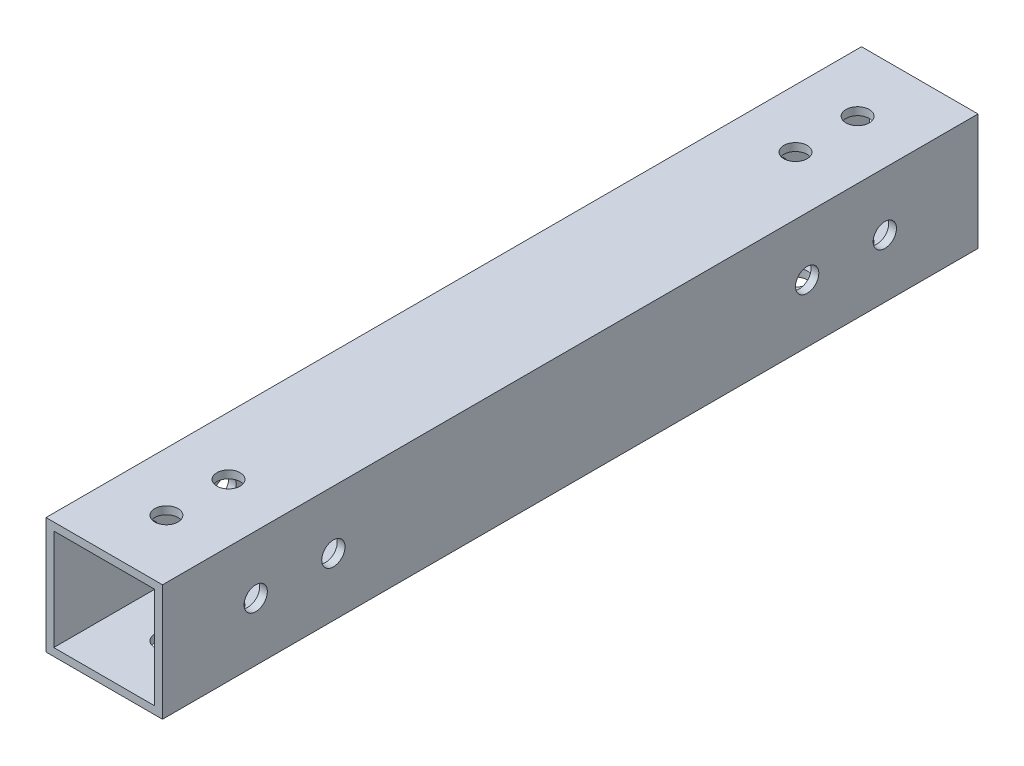
ISO-10303-21;
HEADER;
FILE_DESCRIPTION(('STEP AP214'),'2;1');
FILE_NAME('part.step','',(''),(''),'','','');
FILE_SCHEMA(('AUTOMOTIVE_DESIGN { 1 0 10303 214 1 1 1 1 }'));
ENDSEC;
DATA;
#1=APPLICATION_CONTEXT('core data for automotive mechanical design processes');
#2=APPLICATION_PROTOCOL_DEFINITION('international standard','automotive_design',2000,#1);
#3=PRODUCT_CONTEXT('',#1,'mechanical');
#4=PRODUCT('Part','Part','',(#3));
#5=PRODUCT_RELATED_PRODUCT_CATEGORY('part','',(#4));
#6=PRODUCT_DEFINITION_FORMATION('','',#4);
#7=PRODUCT_DEFINITION_CONTEXT('part definition',#1,'design');
#8=PRODUCT_DEFINITION('design','',#6,#7);
#9=PRODUCT_DEFINITION_SHAPE('','',#8);
#10=(LENGTH_UNIT() NAMED_UNIT(*) SI_UNIT(.MILLI.,.METRE.));
#11=(NAMED_UNIT(*) PLANE_ANGLE_UNIT() SI_UNIT($,.RADIAN.));
#12=(NAMED_UNIT(*) SI_UNIT($,.STERADIAN.) SOLID_ANGLE_UNIT());
#13=UNCERTAINTY_MEASURE_WITH_UNIT(LENGTH_MEASURE(1.E-05),#10,'distance_accuracy_value','');
#14=(GEOMETRIC_REPRESENTATION_CONTEXT(3) GLOBAL_UNCERTAINTY_ASSIGNED_CONTEXT((#13)) GLOBAL_UNIT_ASSIGNED_CONTEXT((#10,
#11,#12)) REPRESENTATION_CONTEXT('',''));
#15=CARTESIAN_POINT('',(0.,0.,0.));
#16=DIRECTION('',(0.,0.,1.));
#17=DIRECTION('',(1.,0.,0.));
#18=AXIS2_PLACEMENT_3D('',#15,#16,#17);
#19=CARTESIAN_POINT('',(0.,0.,105.));
#20=DIRECTION('',(0.,0.,-1.));
#21=DIRECTION('',(-1.,0.,0.));
#22=AXIS2_PLACEMENT_3D('',#19,#20,#21);
#23=PLANE('',#22);
#24=DIRECTION('',(0.,1.,0.));
#25=VECTOR('',#24,1.);
#26=CARTESIAN_POINT('',(7.5,-7.5,105.));
#27=LINE('',#26,#25);
#28=CARTESIAN_POINT('',(7.5,-7.5,105.));
#29=VERTEX_POINT('',#28);
#30=CARTESIAN_POINT('',(7.5,7.5,105.));
#31=VERTEX_POINT('',#30);
#32=EDGE_CURVE('E139',#29,#31,#27,.T.);
#33=ORIENTED_EDGE('',*,*,#32,.T.);
#34=DIRECTION('',(-1.,0.,0.));
#35=VECTOR('',#34,1.);
#36=CARTESIAN_POINT('',(-7.5,7.5,105.));
#37=LINE('',#36,#35);
#38=CARTESIAN_POINT('',(-7.5,7.5,105.));
#39=VERTEX_POINT('',#38);
#40=EDGE_CURVE('E142',#31,#39,#37,.T.);
#41=ORIENTED_EDGE('',*,*,#40,.T.);
#42=DIRECTION('',(0.,-1.,0.));
#43=VECTOR('',#42,1.);
#44=CARTESIAN_POINT('',(-7.5,-7.5,105.));
#45=LINE('',#44,#43);
#46=CARTESIAN_POINT('',(-7.5,-7.5,105.));
#47=VERTEX_POINT('',#46);
#48=EDGE_CURVE('E145',#39,#47,#45,.T.);
#49=ORIENTED_EDGE('',*,*,#48,.T.);
#50=DIRECTION('',(1.,0.,0.));
#51=VECTOR('',#50,1.);
#52=CARTESIAN_POINT('',(-7.5,-7.5,105.));
#53=LINE('',#52,#51);
#54=EDGE_CURVE('E147',#47,#29,#53,.T.);
#55=ORIENTED_EDGE('',*,*,#54,.T.);
#56=EDGE_LOOP('',(#33,#41,#49,#55));
#57=FACE_BOUND('',#56,.T.);
#58=DIRECTION('',(0.,1.,0.));
#59=VECTOR('',#58,1.);
#60=CARTESIAN_POINT('',(6.5,-6.5,105.));
#61=LINE('',#60,#59);
#62=CARTESIAN_POINT('',(6.5,-6.5,105.));
#63=VERTEX_POINT('',#62);
#64=CARTESIAN_POINT('',(6.5,6.5,105.));
#65=VERTEX_POINT('',#64);
#66=EDGE_CURVE('E101',#63,#65,#61,.T.);
#67=ORIENTED_EDGE('',*,*,#66,.F.);
#68=DIRECTION('',(1.,0.,0.));
#69=VECTOR('',#68,1.);
#70=CARTESIAN_POINT('',(-6.5,-6.5,105.));
#71=LINE('',#70,#69);
#72=CARTESIAN_POINT('',(-6.5,-6.5,105.));
#73=VERTEX_POINT('',#72);
#74=EDGE_CURVE('E123',#73,#63,#71,.T.);
#75=ORIENTED_EDGE('',*,*,#74,.F.);
#76=DIRECTION('',(0.,-1.,0.));
#77=VECTOR('',#76,1.);
#78=CARTESIAN_POINT('',(-6.5,-6.5,105.));
#79=LINE('',#78,#77);
#80=CARTESIAN_POINT('',(-6.5,6.5,105.));
#81=VERTEX_POINT('',#80);
#82=EDGE_CURVE('E121',#81,#73,#79,.T.);
#83=ORIENTED_EDGE('',*,*,#82,.F.);
#84=DIRECTION('',(-1.,0.,0.));
#85=VECTOR('',#84,1.);
#86=CARTESIAN_POINT('',(-6.5,6.5,105.));
#87=LINE('',#86,#85);
#88=EDGE_CURVE('E109',#65,#81,#87,.T.);
#89=ORIENTED_EDGE('',*,*,#88,.F.);
#90=EDGE_LOOP('',(#67,#75,#83,#89));
#91=FACE_BOUND('',#90,.T.);
#92=ADVANCED_FACE('F34',(#57,#91),#23,.F.);
#93=CARTESIAN_POINT('',(0.,0.,0.));
#94=DIRECTION('',(0.,0.,-1.));
#95=DIRECTION('',(-1.,0.,0.));
#96=AXIS2_PLACEMENT_3D('',#93,#94,#95);
#97=PLANE('',#96);
#98=DIRECTION('',(0.,1.,0.));
#99=VECTOR('',#98,1.);
#100=CARTESIAN_POINT('',(7.5,-7.5,0.));
#101=LINE('',#100,#99);
#102=CARTESIAN_POINT('',(7.5,-7.5,0.));
#103=VERTEX_POINT('',#102);
#104=CARTESIAN_POINT('',(7.5,7.5,0.));
#105=VERTEX_POINT('',#104);
#106=EDGE_CURVE('E117',#103,#105,#101,.T.);
#107=ORIENTED_EDGE('',*,*,#106,.F.);
#108=DIRECTION('',(1.,0.,0.));
#109=VECTOR('',#108,1.);
#110=CARTESIAN_POINT('',(-7.5,-7.5,0.));
#111=LINE('',#110,#109);
#112=CARTESIAN_POINT('',(-7.5,-7.5,0.));
#113=VERTEX_POINT('',#112);
#114=EDGE_CURVE('E143',#113,#103,#111,.T.);
#115=ORIENTED_EDGE('',*,*,#114,.F.);
#116=DIRECTION('',(0.,-1.,0.));
#117=VECTOR('',#116,1.);
#118=CARTESIAN_POINT('',(-7.5,-7.5,0.));
#119=LINE('',#118,#117);
#120=CARTESIAN_POINT('',(-7.5,7.5,0.));
#121=VERTEX_POINT('',#120);
#122=EDGE_CURVE('E154',#121,#113,#119,.T.);
#123=ORIENTED_EDGE('',*,*,#122,.F.);
#124=DIRECTION('',(-1.,0.,0.));
#125=VECTOR('',#124,1.);
#126=CARTESIAN_POINT('',(-7.5,7.5,0.));
#127=LINE('',#126,#125);
#128=EDGE_CURVE('E152',#105,#121,#127,.T.);
#129=ORIENTED_EDGE('',*,*,#128,.F.);
#130=EDGE_LOOP('',(#107,#115,#123,#129));
#131=FACE_BOUND('',#130,.T.);
#132=DIRECTION('',(1.,0.,0.));
#133=VECTOR('',#132,1.);
#134=CARTESIAN_POINT('',(-6.5,-6.5,0.));
#135=LINE('',#134,#133);
#136=CARTESIAN_POINT('',(-6.5,-6.5,0.));
#137=VERTEX_POINT('',#136);
#138=CARTESIAN_POINT('',(6.5,-6.5,0.));
#139=VERTEX_POINT('',#138);
#140=EDGE_CURVE('E110',#137,#139,#135,.T.);
#141=ORIENTED_EDGE('',*,*,#140,.T.);
#142=DIRECTION('',(0.,1.,0.));
#143=VECTOR('',#142,1.);
#144=CARTESIAN_POINT('',(6.5,-6.5,0.));
#145=LINE('',#144,#143);
#146=CARTESIAN_POINT('',(6.5,6.5,0.));
#147=VERTEX_POINT('',#146);
#148=EDGE_CURVE('E59',#139,#147,#145,.T.);
#149=ORIENTED_EDGE('',*,*,#148,.T.);
#150=DIRECTION('',(-1.,0.,0.));
#151=VECTOR('',#150,1.);
#152=CARTESIAN_POINT('',(-6.5,6.5,0.));
#153=LINE('',#152,#151);
#154=CARTESIAN_POINT('',(-6.5,6.5,0.));
#155=VERTEX_POINT('',#154);
#156=EDGE_CURVE('E116',#147,#155,#153,.T.);
#157=ORIENTED_EDGE('',*,*,#156,.T.);
#158=DIRECTION('',(0.,-1.,0.));
#159=VECTOR('',#158,1.);
#160=CARTESIAN_POINT('',(-6.5,-6.5,0.));
#161=LINE('',#160,#159);
#162=EDGE_CURVE('E131',#155,#137,#161,.T.);
#163=ORIENTED_EDGE('',*,*,#162,.T.);
#164=EDGE_LOOP('',(#141,#149,#157,#163));
#165=FACE_BOUND('',#164,.T.);
#166=ADVANCED_FACE('F265',(#131,#165),#97,.T.);
#167=CARTESIAN_POINT('',(7.5,-7.5,105.));
#168=DIRECTION('',(-1.,0.,0.));
#169=DIRECTION('',(0.,0.,1.));
#170=AXIS2_PLACEMENT_3D('',#167,#168,#169);
#171=PLANE('',#170);
#172=CARTESIAN_POINT('',(7.5,0.,83.));
#173=DIRECTION('',(-1.,0.,0.));
#174=DIRECTION('',(0.,0.,1.));
#175=AXIS2_PLACEMENT_3D('',#172,#173,#174);
#176=CIRCLE('',#175,1.5);
#177=CARTESIAN_POINT('',(7.5,0.,84.5));
#178=VERTEX_POINT('',#177);
#179=EDGE_CURVE('E189',#178,#178,#176,.T.);
#180=ORIENTED_EDGE('',*,*,#179,.T.);
#181=EDGE_LOOP('',(#180));
#182=FACE_BOUND('',#181,.T.);
#183=CARTESIAN_POINT('',(7.5,0.,12.));
#184=DIRECTION('',(-1.,0.,0.));
#185=DIRECTION('',(0.,0.,1.));
#186=AXIS2_PLACEMENT_3D('',#183,#184,#185);
#187=CIRCLE('',#186,1.5);
#188=CARTESIAN_POINT('',(7.5,0.,13.5));
#189=VERTEX_POINT('',#188);
#190=EDGE_CURVE('E373',#189,#189,#187,.T.);
#191=ORIENTED_EDGE('',*,*,#190,.T.);
#192=EDGE_LOOP('',(#191));
#193=FACE_BOUND('',#192,.T.);
#194=CARTESIAN_POINT('',(7.5,0.,22.));
#195=DIRECTION('',(-1.,0.,0.));
#196=DIRECTION('',(0.,0.,1.));
#197=AXIS2_PLACEMENT_3D('',#194,#195,#196);
#198=CIRCLE('',#197,1.5);
#199=CARTESIAN_POINT('',(7.5,0.,23.5));
#200=VERTEX_POINT('',#199);
#201=EDGE_CURVE('E380',#200,#200,#198,.T.);
#202=ORIENTED_EDGE('',*,*,#201,.T.);
#203=EDGE_LOOP('',(#202));
#204=FACE_BOUND('',#203,.T.);
#205=CARTESIAN_POINT('',(7.5,0.,93.));
#206=DIRECTION('',(-1.,0.,0.));
#207=DIRECTION('',(0.,0.,1.));
#208=AXIS2_PLACEMENT_3D('',#205,#206,#207);
#209=CIRCLE('',#208,1.5);
#210=CARTESIAN_POINT('',(7.5,0.,94.5));
#211=VERTEX_POINT('',#210);
#212=EDGE_CURVE('E185',#211,#211,#209,.T.);
#213=ORIENTED_EDGE('',*,*,#212,.T.);
#214=EDGE_LOOP('',(#213));
#215=FACE_BOUND('',#214,.T.);
#216=ORIENTED_EDGE('',*,*,#106,.T.);
#217=DIRECTION('',(0.,0.,-1.));
#218=VECTOR('',#217,1.);
#219=CARTESIAN_POINT('',(7.5,7.5,105.));
#220=LINE('',#219,#218);
#221=EDGE_CURVE('E11',#31,#105,#220,.T.);
#222=ORIENTED_EDGE('',*,*,#221,.F.);
#223=ORIENTED_EDGE('',*,*,#32,.F.);
#224=DIRECTION('',(0.,0.,-1.));
#225=VECTOR('',#224,1.);
#226=CARTESIAN_POINT('',(7.5,-7.5,105.));
#227=LINE('',#226,#225);
#228=EDGE_CURVE('E149',#29,#103,#227,.T.);
#229=ORIENTED_EDGE('',*,*,#228,.T.);
#230=EDGE_LOOP('',(#216,#222,#223,#229));
#231=FACE_BOUND('',#230,.T.);
#232=ADVANCED_FACE('F36',(#182,#193,#204,#215,#231),#171,.F.);
#233=CARTESIAN_POINT('',(-7.5,7.5,105.));
#234=DIRECTION('',(0.,-1.,0.));
#235=DIRECTION('',(0.,0.,-1.));
#236=AXIS2_PLACEMENT_3D('',#233,#234,#235);
#237=PLANE('',#236);
#238=CARTESIAN_POINT('',(0.,7.5,89.));
#239=DIRECTION('',(0.,1.,0.));
#240=DIRECTION('',(0.,0.,1.));
#241=AXIS2_PLACEMENT_3D('',#238,#239,#240);
#242=CIRCLE('',#241,1.5);
#243=CARTESIAN_POINT('',(0.,7.5,90.5));
#244=VERTEX_POINT('',#243);
#245=EDGE_CURVE('E218',#244,#244,#242,.T.);
#246=ORIENTED_EDGE('',*,*,#245,.F.);
#247=EDGE_LOOP('',(#246));
#248=FACE_BOUND('',#247,.T.);
#249=CARTESIAN_POINT('',(0.,7.5,8.));
#250=DIRECTION('',(0.,1.,0.));
#251=DIRECTION('',(0.,0.,1.));
#252=AXIS2_PLACEMENT_3D('',#249,#250,#251);
#253=CIRCLE('',#252,1.5);
#254=CARTESIAN_POINT('',(0.,7.5,9.5));
#255=VERTEX_POINT('',#254);
#256=EDGE_CURVE('E224',#255,#255,#253,.T.);
#257=ORIENTED_EDGE('',*,*,#256,.F.);
#258=EDGE_LOOP('',(#257));
#259=FACE_BOUND('',#258,.T.);
#260=CARTESIAN_POINT('',(0.,7.5,16.));
#261=DIRECTION('',(0.,1.,0.));
#262=DIRECTION('',(0.,0.,1.));
#263=AXIS2_PLACEMENT_3D('',#260,#261,#262);
#264=CIRCLE('',#263,1.5);
#265=CARTESIAN_POINT('',(0.,7.5,17.5));
#266=VERTEX_POINT('',#265);
#267=EDGE_CURVE('E215',#266,#266,#264,.T.);
#268=ORIENTED_EDGE('',*,*,#267,.F.);
#269=EDGE_LOOP('',(#268));
#270=FACE_BOUND('',#269,.T.);
#271=CARTESIAN_POINT('',(0.,7.5,97.));
#272=DIRECTION('',(0.,1.,0.));
#273=DIRECTION('',(0.,0.,1.));
#274=AXIS2_PLACEMENT_3D('',#271,#272,#273);
#275=CIRCLE('',#274,1.5);
#276=CARTESIAN_POINT('',(0.,7.5,98.5));
#277=VERTEX_POINT('',#276);
#278=EDGE_CURVE('E238',#277,#277,#275,.T.);
#279=ORIENTED_EDGE('',*,*,#278,.F.);
#280=EDGE_LOOP('',(#279));
#281=FACE_BOUND('',#280,.T.);
#282=ORIENTED_EDGE('',*,*,#128,.T.);
#283=DIRECTION('',(0.,0.,-1.));
#284=VECTOR('',#283,1.);
#285=CARTESIAN_POINT('',(-7.5,7.5,105.));
#286=LINE('',#285,#284);
#287=EDGE_CURVE('E43',#39,#121,#286,.T.);
#288=ORIENTED_EDGE('',*,*,#287,.F.);
#289=ORIENTED_EDGE('',*,*,#40,.F.);
#290=ORIENTED_EDGE('',*,*,#221,.T.);
#291=EDGE_LOOP('',(#282,#288,#289,#290));
#292=FACE_BOUND('',#291,.T.);
#293=ADVANCED_FACE('F279',(#248,#259,#270,#281,#292),#237,.F.);
#294=CARTESIAN_POINT('',(-7.5,-7.5,105.));
#295=DIRECTION('',(1.,0.,0.));
#296=DIRECTION('',(0.,0.,-1.));
#297=AXIS2_PLACEMENT_3D('',#294,#295,#296);
#298=PLANE('',#297);
#299=CARTESIAN_POINT('',(-7.5,0.,83.));
#300=DIRECTION('',(-1.,0.,0.));
#301=DIRECTION('',(0.,0.,1.));
#302=AXIS2_PLACEMENT_3D('',#299,#300,#301);
#303=CIRCLE('',#302,1.5);
#304=CARTESIAN_POINT('',(-7.5,0.,84.5));
#305=VERTEX_POINT('',#304);
#306=EDGE_CURVE('E370',#305,#305,#303,.T.);
#307=ORIENTED_EDGE('',*,*,#306,.F.);
#308=EDGE_LOOP('',(#307));
#309=FACE_BOUND('',#308,.T.);
#310=CARTESIAN_POINT('',(-7.5,0.,12.));
#311=DIRECTION('',(-1.,0.,0.));
#312=DIRECTION('',(0.,0.,1.));
#313=AXIS2_PLACEMENT_3D('',#310,#311,#312);
#314=CIRCLE('',#313,1.5);
#315=CARTESIAN_POINT('',(-7.5,0.,13.5));
#316=VERTEX_POINT('',#315);
#317=EDGE_CURVE('E378',#316,#316,#314,.T.);
#318=ORIENTED_EDGE('',*,*,#317,.F.);
#319=EDGE_LOOP('',(#318));
#320=FACE_BOUND('',#319,.T.);
#321=CARTESIAN_POINT('',(-7.5,0.,22.));
#322=DIRECTION('',(-1.,0.,0.));
#323=DIRECTION('',(0.,0.,1.));
#324=AXIS2_PLACEMENT_3D('',#321,#322,#323);
#325=CIRCLE('',#324,1.5);
#326=CARTESIAN_POINT('',(-7.5,0.,23.5));
#327=VERTEX_POINT('',#326);
#328=EDGE_CURVE('E202',#327,#327,#325,.T.);
#329=ORIENTED_EDGE('',*,*,#328,.F.);
#330=EDGE_LOOP('',(#329));
#331=FACE_BOUND('',#330,.T.);
#332=CARTESIAN_POINT('',(-7.5,0.,93.));
#333=DIRECTION('',(-1.,0.,0.));
#334=DIRECTION('',(0.,0.,1.));
#335=AXIS2_PLACEMENT_3D('',#332,#333,#334);
#336=CIRCLE('',#335,1.5);
#337=CARTESIAN_POINT('',(-7.5,0.,94.5));
#338=VERTEX_POINT('',#337);
#339=EDGE_CURVE('E208',#338,#338,#336,.T.);
#340=ORIENTED_EDGE('',*,*,#339,.F.);
#341=EDGE_LOOP('',(#340));
#342=FACE_BOUND('',#341,.T.);
#343=ORIENTED_EDGE('',*,*,#122,.T.);
#344=DIRECTION('',(0.,0.,-1.));
#345=VECTOR('',#344,1.);
#346=CARTESIAN_POINT('',(-7.5,-7.5,105.));
#347=LINE('',#346,#345);
#348=EDGE_CURVE('E159',#47,#113,#347,.T.);
#349=ORIENTED_EDGE('',*,*,#348,.F.);
#350=ORIENTED_EDGE('',*,*,#48,.F.);
#351=ORIENTED_EDGE('',*,*,#287,.T.);
#352=EDGE_LOOP('',(#343,#349,#350,#351));
#353=FACE_BOUND('',#352,.T.);
#354=ADVANCED_FACE('F276',(#309,#320,#331,#342,#353),#298,.F.);
#355=CARTESIAN_POINT('',(-7.5,-7.5,105.));
#356=DIRECTION('',(0.,1.,0.));
#357=DIRECTION('',(0.,0.,1.));
#358=AXIS2_PLACEMENT_3D('',#355,#356,#357);
#359=PLANE('',#358);
#360=CARTESIAN_POINT('',(0.,-7.5,89.));
#361=DIRECTION('',(0.,1.,0.));
#362=DIRECTION('',(0.,0.,1.));
#363=AXIS2_PLACEMENT_3D('',#360,#361,#362);
#364=CIRCLE('',#363,1.5);
#365=CARTESIAN_POINT('',(0.,-7.5,90.5));
#366=VERTEX_POINT('',#365);
#367=EDGE_CURVE('E172',#366,#366,#364,.T.);
#368=ORIENTED_EDGE('',*,*,#367,.T.);
#369=EDGE_LOOP('',(#368));
#370=FACE_BOUND('',#369,.T.);
#371=CARTESIAN_POINT('',(0.,-7.5,8.));
#372=DIRECTION('',(0.,1.,0.));
#373=DIRECTION('',(0.,0.,1.));
#374=AXIS2_PLACEMENT_3D('',#371,#372,#373);
#375=CIRCLE('',#374,1.5);
#376=CARTESIAN_POINT('',(0.,-7.5,9.5));
#377=VERTEX_POINT('',#376);
#378=EDGE_CURVE('E221',#377,#377,#375,.T.);
#379=ORIENTED_EDGE('',*,*,#378,.T.);
#380=EDGE_LOOP('',(#379));
#381=FACE_BOUND('',#380,.T.);
#382=CARTESIAN_POINT('',(0.,-7.5,16.));
#383=DIRECTION('',(0.,1.,0.));
#384=DIRECTION('',(0.,0.,1.));
#385=AXIS2_PLACEMENT_3D('',#382,#383,#384);
#386=CIRCLE('',#385,1.5);
#387=CARTESIAN_POINT('',(0.,-7.5,17.5));
#388=VERTEX_POINT('',#387);
#389=EDGE_CURVE('E227',#388,#388,#386,.T.);
#390=ORIENTED_EDGE('',*,*,#389,.T.);
#391=EDGE_LOOP('',(#390));
#392=FACE_BOUND('',#391,.T.);
#393=CARTESIAN_POINT('',(0.,-7.5,97.));
#394=DIRECTION('',(0.,1.,0.));
#395=DIRECTION('',(0.,0.,1.));
#396=AXIS2_PLACEMENT_3D('',#393,#394,#395);
#397=CIRCLE('',#396,1.5);
#398=CARTESIAN_POINT('',(0.,-7.5,98.5));
#399=VERTEX_POINT('',#398);
#400=EDGE_CURVE('E167',#399,#399,#397,.T.);
#401=ORIENTED_EDGE('',*,*,#400,.T.);
#402=EDGE_LOOP('',(#401));
#403=FACE_BOUND('',#402,.T.);
#404=ORIENTED_EDGE('',*,*,#114,.T.);
#405=ORIENTED_EDGE('',*,*,#228,.F.);
#406=ORIENTED_EDGE('',*,*,#54,.F.);
#407=ORIENTED_EDGE('',*,*,#348,.T.);
#408=EDGE_LOOP('',(#404,#405,#406,#407));
#409=FACE_BOUND('',#408,.T.);
#410=ADVANCED_FACE('F259',(#370,#381,#392,#403,#409),#359,.F.);
#411=CARTESIAN_POINT('',(6.5,-6.5,105.));
#412=DIRECTION('',(-1.,0.,0.));
#413=DIRECTION('',(0.,0.,1.));
#414=AXIS2_PLACEMENT_3D('',#411,#412,#413);
#415=PLANE('',#414);
#416=CARTESIAN_POINT('',(6.5,0.,83.));
#417=DIRECTION('',(-1.,0.,0.));
#418=DIRECTION('',(0.,0.,1.));
#419=AXIS2_PLACEMENT_3D('',#416,#417,#418);
#420=CIRCLE('',#419,1.5);
#421=CARTESIAN_POINT('',(6.5,0.,84.5));
#422=VERTEX_POINT('',#421);
#423=EDGE_CURVE('E205',#422,#422,#420,.T.);
#424=ORIENTED_EDGE('',*,*,#423,.F.);
#425=EDGE_LOOP('',(#424));
#426=FACE_BOUND('',#425,.T.);
#427=CARTESIAN_POINT('',(6.5,0.,12.));
#428=DIRECTION('',(-1.,0.,0.));
#429=DIRECTION('',(0.,0.,1.));
#430=AXIS2_PLACEMENT_3D('',#427,#428,#429);
#431=CIRCLE('',#430,1.5);
#432=CARTESIAN_POINT('',(6.5,0.,13.5));
#433=VERTEX_POINT('',#432);
#434=EDGE_CURVE('E192',#433,#433,#431,.T.);
#435=ORIENTED_EDGE('',*,*,#434,.F.);
#436=EDGE_LOOP('',(#435));
#437=FACE_BOUND('',#436,.T.);
#438=CARTESIAN_POINT('',(6.5,0.,22.));
#439=DIRECTION('',(-1.,0.,0.));
#440=DIRECTION('',(0.,0.,1.));
#441=AXIS2_PLACEMENT_3D('',#438,#439,#440);
#442=CIRCLE('',#441,1.5);
#443=CARTESIAN_POINT('',(6.5,0.,23.5));
#444=VERTEX_POINT('',#443);
#445=EDGE_CURVE('E188',#444,#444,#442,.T.);
#446=ORIENTED_EDGE('',*,*,#445,.F.);
#447=EDGE_LOOP('',(#446));
#448=FACE_BOUND('',#447,.T.);
#449=CARTESIAN_POINT('',(6.5,0.,93.));
#450=DIRECTION('',(-1.,0.,0.));
#451=DIRECTION('',(0.,0.,1.));
#452=AXIS2_PLACEMENT_3D('',#449,#450,#451);
#453=CIRCLE('',#452,1.5);
#454=CARTESIAN_POINT('',(6.5,0.,94.5));
#455=VERTEX_POINT('',#454);
#456=EDGE_CURVE('E184',#455,#455,#453,.T.);
#457=ORIENTED_EDGE('',*,*,#456,.F.);
#458=EDGE_LOOP('',(#457));
#459=FACE_BOUND('',#458,.T.);
#460=ORIENTED_EDGE('',*,*,#148,.F.);
#461=DIRECTION('',(0.,0.,-1.));
#462=VECTOR('',#461,1.);
#463=CARTESIAN_POINT('',(6.5,-6.5,105.));
#464=LINE('',#463,#462);
#465=EDGE_CURVE('E105',#63,#139,#464,.T.);
#466=ORIENTED_EDGE('',*,*,#465,.F.);
#467=ORIENTED_EDGE('',*,*,#66,.T.);
#468=DIRECTION('',(0.,0.,-1.));
#469=VECTOR('',#468,1.);
#470=CARTESIAN_POINT('',(6.5,6.5,105.));
#471=LINE('',#470,#469);
#472=EDGE_CURVE('E104',#65,#147,#471,.T.);
#473=ORIENTED_EDGE('',*,*,#472,.T.);
#474=EDGE_LOOP('',(#460,#466,#467,#473));
#475=FACE_BOUND('',#474,.T.);
#476=ADVANCED_FACE('F103',(#426,#437,#448,#459,#475),#415,.T.);
#477=CARTESIAN_POINT('',(-6.5,6.5,105.));
#478=DIRECTION('',(0.,-1.,0.));
#479=DIRECTION('',(0.,0.,-1.));
#480=AXIS2_PLACEMENT_3D('',#477,#478,#479);
#481=PLANE('',#480);
#482=CARTESIAN_POINT('',(0.,6.5,89.));
#483=DIRECTION('',(0.,-1.,0.));
#484=DIRECTION('',(0.,0.,-1.));
#485=AXIS2_PLACEMENT_3D('',#482,#483,#484);
#486=CIRCLE('',#485,1.5);
#487=CARTESIAN_POINT('',(0.,6.5,87.5));
#488=VERTEX_POINT('',#487);
#489=EDGE_CURVE('E180',#488,#488,#486,.T.);
#490=ORIENTED_EDGE('',*,*,#489,.F.);
#491=EDGE_LOOP('',(#490));
#492=FACE_BOUND('',#491,.T.);
#493=CARTESIAN_POINT('',(0.,6.5,8.));
#494=DIRECTION('',(0.,-1.,0.));
#495=DIRECTION('',(0.,0.,-1.));
#496=AXIS2_PLACEMENT_3D('',#493,#494,#495);
#497=CIRCLE('',#496,1.5);
#498=CARTESIAN_POINT('',(0.,6.5,6.5));
#499=VERTEX_POINT('',#498);
#500=EDGE_CURVE('E176',#499,#499,#497,.T.);
#501=ORIENTED_EDGE('',*,*,#500,.F.);
#502=EDGE_LOOP('',(#501));
#503=FACE_BOUND('',#502,.T.);
#504=CARTESIAN_POINT('',(0.,6.5,16.));
#505=DIRECTION('',(0.,-1.,0.));
#506=DIRECTION('',(0.,0.,-1.));
#507=AXIS2_PLACEMENT_3D('',#504,#505,#506);
#508=CIRCLE('',#507,1.5);
#509=CARTESIAN_POINT('',(0.,6.5,14.5));
#510=VERTEX_POINT('',#509);
#511=EDGE_CURVE('E171',#510,#510,#508,.T.);
#512=ORIENTED_EDGE('',*,*,#511,.F.);
#513=EDGE_LOOP('',(#512));
#514=FACE_BOUND('',#513,.T.);
#515=CARTESIAN_POINT('',(0.,6.5,97.));
#516=DIRECTION('',(0.,-1.,0.));
#517=DIRECTION('',(0.,0.,-1.));
#518=AXIS2_PLACEMENT_3D('',#515,#516,#517);
#519=CIRCLE('',#518,1.5);
#520=CARTESIAN_POINT('',(0.,6.5,95.5));
#521=VERTEX_POINT('',#520);
#522=EDGE_CURVE('E129',#521,#521,#519,.T.);
#523=ORIENTED_EDGE('',*,*,#522,.F.);
#524=EDGE_LOOP('',(#523));
#525=FACE_BOUND('',#524,.T.);
#526=ORIENTED_EDGE('',*,*,#156,.F.);
#527=ORIENTED_EDGE('',*,*,#472,.F.);
#528=ORIENTED_EDGE('',*,*,#88,.T.);
#529=DIRECTION('',(0.,0.,-1.));
#530=VECTOR('',#529,1.);
#531=CARTESIAN_POINT('',(-6.5,6.5,105.));
#532=LINE('',#531,#530);
#533=EDGE_CURVE('E118',#81,#155,#532,.T.);
#534=ORIENTED_EDGE('',*,*,#533,.T.);
#535=EDGE_LOOP('',(#526,#527,#528,#534));
#536=FACE_BOUND('',#535,.T.);
#537=ADVANCED_FACE('F113',(#492,#503,#514,#525,#536),#481,.T.);
#538=CARTESIAN_POINT('',(-6.5,-6.5,105.));
#539=DIRECTION('',(1.,0.,0.));
#540=DIRECTION('',(0.,0.,-1.));
#541=AXIS2_PLACEMENT_3D('',#538,#539,#540);
#542=PLANE('',#541);
#543=CARTESIAN_POINT('',(-6.5,0.,83.));
#544=DIRECTION('',(1.,0.,0.));
#545=DIRECTION('',(0.,0.,-1.));
#546=AXIS2_PLACEMENT_3D('',#543,#544,#545);
#547=CIRCLE('',#546,1.5);
#548=CARTESIAN_POINT('',(-6.5,0.,81.5));
#549=VERTEX_POINT('',#548);
#550=EDGE_CURVE('E38',#549,#549,#547,.T.);
#551=ORIENTED_EDGE('',*,*,#550,.F.);
#552=EDGE_LOOP('',(#551));
#553=FACE_BOUND('',#552,.T.);
#554=CARTESIAN_POINT('',(-6.5,0.,12.));
#555=DIRECTION('',(1.,0.,0.));
#556=DIRECTION('',(0.,0.,-1.));
#557=AXIS2_PLACEMENT_3D('',#554,#555,#556);
#558=CIRCLE('',#557,1.5);
#559=CARTESIAN_POINT('',(-6.5,0.,10.5));
#560=VERTEX_POINT('',#559);
#561=EDGE_CURVE('E190',#560,#560,#558,.T.);
#562=ORIENTED_EDGE('',*,*,#561,.F.);
#563=EDGE_LOOP('',(#562));
#564=FACE_BOUND('',#563,.T.);
#565=CARTESIAN_POINT('',(-6.5,0.,22.));
#566=DIRECTION('',(1.,0.,0.));
#567=DIRECTION('',(0.,0.,-1.));
#568=AXIS2_PLACEMENT_3D('',#565,#566,#567);
#569=CIRCLE('',#568,1.5);
#570=CARTESIAN_POINT('',(-6.5,0.,20.5));
#571=VERTEX_POINT('',#570);
#572=EDGE_CURVE('E186',#571,#571,#569,.T.);
#573=ORIENTED_EDGE('',*,*,#572,.F.);
#574=EDGE_LOOP('',(#573));
#575=FACE_BOUND('',#574,.T.);
#576=CARTESIAN_POINT('',(-6.5,0.,93.));
#577=DIRECTION('',(1.,0.,0.));
#578=DIRECTION('',(0.,0.,-1.));
#579=AXIS2_PLACEMENT_3D('',#576,#577,#578);
#580=CIRCLE('',#579,1.5);
#581=CARTESIAN_POINT('',(-6.5,0.,91.5));
#582=VERTEX_POINT('',#581);
#583=EDGE_CURVE('E181',#582,#582,#580,.T.);
#584=ORIENTED_EDGE('',*,*,#583,.F.);
#585=EDGE_LOOP('',(#584));
#586=FACE_BOUND('',#585,.T.);
#587=ORIENTED_EDGE('',*,*,#162,.F.);
#588=ORIENTED_EDGE('',*,*,#533,.F.);
#589=ORIENTED_EDGE('',*,*,#82,.T.);
#590=DIRECTION('',(0.,0.,-1.));
#591=VECTOR('',#590,1.);
#592=CARTESIAN_POINT('',(-6.5,-6.5,105.));
#593=LINE('',#592,#591);
#594=EDGE_CURVE('E51',#73,#137,#593,.T.);
#595=ORIENTED_EDGE('',*,*,#594,.T.);
#596=EDGE_LOOP('',(#587,#588,#589,#595));
#597=FACE_BOUND('',#596,.T.);
#598=ADVANCED_FACE('F249',(#553,#564,#575,#586,#597),#542,.T.);
#599=CARTESIAN_POINT('',(-6.5,-6.5,105.));
#600=DIRECTION('',(0.,1.,0.));
#601=DIRECTION('',(0.,0.,1.));
#602=AXIS2_PLACEMENT_3D('',#599,#600,#601);
#603=PLANE('',#602);
#604=CARTESIAN_POINT('',(0.,-6.5,89.));
#605=DIRECTION('',(0.,1.,0.));
#606=DIRECTION('',(0.,0.,1.));
#607=AXIS2_PLACEMENT_3D('',#604,#605,#606);
#608=CIRCLE('',#607,1.5);
#609=CARTESIAN_POINT('',(0.,-6.5,90.5));
#610=VERTEX_POINT('',#609);
#611=EDGE_CURVE('E177',#610,#610,#608,.T.);
#612=ORIENTED_EDGE('',*,*,#611,.F.);
#613=EDGE_LOOP('',(#612));
#614=FACE_BOUND('',#613,.T.);
#615=CARTESIAN_POINT('',(0.,-6.5,8.));
#616=DIRECTION('',(0.,1.,0.));
#617=DIRECTION('',(0.,0.,1.));
#618=AXIS2_PLACEMENT_3D('',#615,#616,#617);
#619=CIRCLE('',#618,1.5);
#620=CARTESIAN_POINT('',(0.,-6.5,9.5));
#621=VERTEX_POINT('',#620);
#622=EDGE_CURVE('E173',#621,#621,#619,.T.);
#623=ORIENTED_EDGE('',*,*,#622,.F.);
#624=EDGE_LOOP('',(#623));
#625=FACE_BOUND('',#624,.T.);
#626=CARTESIAN_POINT('',(0.,-6.5,16.));
#627=DIRECTION('',(0.,1.,0.));
#628=DIRECTION('',(0.,0.,1.));
#629=AXIS2_PLACEMENT_3D('',#626,#627,#628);
#630=CIRCLE('',#629,1.5);
#631=CARTESIAN_POINT('',(0.,-6.5,17.5));
#632=VERTEX_POINT('',#631);
#633=EDGE_CURVE('E168',#632,#632,#630,.T.);
#634=ORIENTED_EDGE('',*,*,#633,.F.);
#635=EDGE_LOOP('',(#634));
#636=FACE_BOUND('',#635,.T.);
#637=CARTESIAN_POINT('',(0.,-6.5,97.));
#638=DIRECTION('',(0.,1.,0.));
#639=DIRECTION('',(0.,0.,1.));
#640=AXIS2_PLACEMENT_3D('',#637,#638,#639);
#641=CIRCLE('',#640,1.5);
#642=CARTESIAN_POINT('',(0.,-6.5,98.5));
#643=VERTEX_POINT('',#642);
#644=EDGE_CURVE('E164',#643,#643,#641,.T.);
#645=ORIENTED_EDGE('',*,*,#644,.F.);
#646=EDGE_LOOP('',(#645));
#647=FACE_BOUND('',#646,.T.);
#648=ORIENTED_EDGE('',*,*,#140,.F.);
#649=ORIENTED_EDGE('',*,*,#594,.F.);
#650=ORIENTED_EDGE('',*,*,#74,.T.);
#651=ORIENTED_EDGE('',*,*,#465,.T.);
#652=EDGE_LOOP('',(#648,#649,#650,#651));
#653=FACE_BOUND('',#652,.T.);
#654=ADVANCED_FACE('F256',(#614,#625,#636,#647,#653),#603,.T.);
#655=CARTESIAN_POINT('',(0.,-7.5,97.));
#656=DIRECTION('',(0.,1.,0.));
#657=DIRECTION('',(0.,0.,1.));
#658=AXIS2_PLACEMENT_3D('',#655,#656,#657);
#659=CYLINDRICAL_SURFACE('',#658,1.5);
#660=ORIENTED_EDGE('',*,*,#644,.T.);
#661=EDGE_LOOP('',(#660));
#662=FACE_BOUND('',#661,.T.);
#663=ORIENTED_EDGE('',*,*,#400,.F.);
#664=EDGE_LOOP('',(#663));
#665=FACE_BOUND('',#664,.T.);
#666=ADVANCED_FACE('F311',(#662,#665),#659,.F.);
#667=ORIENTED_EDGE('',*,*,#522,.T.);
#668=EDGE_LOOP('',(#667));
#669=FACE_BOUND('',#668,.T.);
#670=ORIENTED_EDGE('',*,*,#278,.T.);
#671=EDGE_LOOP('',(#670));
#672=FACE_BOUND('',#671,.T.);
#673=ADVANCED_FACE('F245',(#669,#672),#659,.F.);
#674=CARTESIAN_POINT('',(0.,-7.5,16.));
#675=DIRECTION('',(0.,1.,0.));
#676=DIRECTION('',(0.,0.,1.));
#677=AXIS2_PLACEMENT_3D('',#674,#675,#676);
#678=CYLINDRICAL_SURFACE('',#677,1.5);
#679=ORIENTED_EDGE('',*,*,#633,.T.);
#680=EDGE_LOOP('',(#679));
#681=FACE_BOUND('',#680,.T.);
#682=ORIENTED_EDGE('',*,*,#389,.F.);
#683=EDGE_LOOP('',(#682));
#684=FACE_BOUND('',#683,.T.);
#685=ADVANCED_FACE('F322',(#681,#684),#678,.F.);
#686=CARTESIAN_POINT('',(0.,-7.5,8.));
#687=DIRECTION('',(0.,1.,0.));
#688=DIRECTION('',(0.,0.,1.));
#689=AXIS2_PLACEMENT_3D('',#686,#687,#688);
#690=CYLINDRICAL_SURFACE('',#689,1.5);
#691=ORIENTED_EDGE('',*,*,#622,.T.);
#692=EDGE_LOOP('',(#691));
#693=FACE_BOUND('',#692,.T.);
#694=ORIENTED_EDGE('',*,*,#378,.F.);
#695=EDGE_LOOP('',(#694));
#696=FACE_BOUND('',#695,.T.);
#697=ADVANCED_FACE('F325',(#693,#696),#690,.F.);
#698=CARTESIAN_POINT('',(0.,-7.5,89.));
#699=DIRECTION('',(0.,1.,0.));
#700=DIRECTION('',(0.,0.,1.));
#701=AXIS2_PLACEMENT_3D('',#698,#699,#700);
#702=CYLINDRICAL_SURFACE('',#701,1.5);
#703=ORIENTED_EDGE('',*,*,#611,.T.);
#704=EDGE_LOOP('',(#703));
#705=FACE_BOUND('',#704,.T.);
#706=ORIENTED_EDGE('',*,*,#367,.F.);
#707=EDGE_LOOP('',(#706));
#708=FACE_BOUND('',#707,.T.);
#709=ADVANCED_FACE('F330',(#705,#708),#702,.F.);
#710=ORIENTED_EDGE('',*,*,#511,.T.);
#711=EDGE_LOOP('',(#710));
#712=FACE_BOUND('',#711,.T.);
#713=ORIENTED_EDGE('',*,*,#267,.T.);
#714=EDGE_LOOP('',(#713));
#715=FACE_BOUND('',#714,.T.);
#716=ADVANCED_FACE('F327',(#712,#715),#678,.F.);
#717=ORIENTED_EDGE('',*,*,#500,.T.);
#718=EDGE_LOOP('',(#717));
#719=FACE_BOUND('',#718,.T.);
#720=ORIENTED_EDGE('',*,*,#256,.T.);
#721=EDGE_LOOP('',(#720));
#722=FACE_BOUND('',#721,.T.);
#723=ADVANCED_FACE('F332',(#719,#722),#690,.F.);
#724=ORIENTED_EDGE('',*,*,#489,.T.);
#725=EDGE_LOOP('',(#724));
#726=FACE_BOUND('',#725,.T.);
#727=ORIENTED_EDGE('',*,*,#245,.T.);
#728=EDGE_LOOP('',(#727));
#729=FACE_BOUND('',#728,.T.);
#730=ADVANCED_FACE('F336',(#726,#729),#702,.F.);
#731=CARTESIAN_POINT('',(7.5,0.,93.));
#732=DIRECTION('',(-1.,0.,0.));
#733=DIRECTION('',(0.,0.,1.));
#734=AXIS2_PLACEMENT_3D('',#731,#732,#733);
#735=CYLINDRICAL_SURFACE('',#734,1.5);
#736=ORIENTED_EDGE('',*,*,#583,.T.);
#737=EDGE_LOOP('',(#736));
#738=FACE_BOUND('',#737,.T.);
#739=ORIENTED_EDGE('',*,*,#339,.T.);
#740=EDGE_LOOP('',(#739));
#741=FACE_BOUND('',#740,.T.);
#742=ADVANCED_FACE('F337',(#738,#741),#735,.F.);
#743=ORIENTED_EDGE('',*,*,#456,.T.);
#744=EDGE_LOOP('',(#743));
#745=FACE_BOUND('',#744,.T.);
#746=ORIENTED_EDGE('',*,*,#212,.F.);
#747=EDGE_LOOP('',(#746));
#748=FACE_BOUND('',#747,.T.);
#749=ADVANCED_FACE('F340',(#745,#748),#735,.F.);
#750=CARTESIAN_POINT('',(7.5,0.,22.));
#751=DIRECTION('',(-1.,0.,0.));
#752=DIRECTION('',(0.,0.,1.));
#753=AXIS2_PLACEMENT_3D('',#750,#751,#752);
#754=CYLINDRICAL_SURFACE('',#753,1.5);
#755=ORIENTED_EDGE('',*,*,#572,.T.);
#756=EDGE_LOOP('',(#755));
#757=FACE_BOUND('',#756,.T.);
#758=ORIENTED_EDGE('',*,*,#328,.T.);
#759=EDGE_LOOP('',(#758));
#760=FACE_BOUND('',#759,.T.);
#761=ADVANCED_FACE('F342',(#757,#760),#754,.F.);
#762=CARTESIAN_POINT('',(7.5,0.,12.));
#763=DIRECTION('',(-1.,0.,0.));
#764=DIRECTION('',(0.,0.,1.));
#765=AXIS2_PLACEMENT_3D('',#762,#763,#764);
#766=CYLINDRICAL_SURFACE('',#765,1.5);
#767=ORIENTED_EDGE('',*,*,#561,.T.);
#768=EDGE_LOOP('',(#767));
#769=FACE_BOUND('',#768,.T.);
#770=ORIENTED_EDGE('',*,*,#317,.T.);
#771=EDGE_LOOP('',(#770));
#772=FACE_BOUND('',#771,.T.);
#773=ADVANCED_FACE('F345',(#769,#772),#766,.F.);
#774=CARTESIAN_POINT('',(7.5,0.,83.));
#775=DIRECTION('',(-1.,0.,0.));
#776=DIRECTION('',(0.,0.,1.));
#777=AXIS2_PLACEMENT_3D('',#774,#775,#776);
#778=CYLINDRICAL_SURFACE('',#777,1.5);
#779=ORIENTED_EDGE('',*,*,#550,.T.);
#780=EDGE_LOOP('',(#779));
#781=FACE_BOUND('',#780,.T.);
#782=ORIENTED_EDGE('',*,*,#306,.T.);
#783=EDGE_LOOP('',(#782));
#784=FACE_BOUND('',#783,.T.);
#785=ADVANCED_FACE('F350',(#781,#784),#778,.F.);
#786=ORIENTED_EDGE('',*,*,#445,.T.);
#787=EDGE_LOOP('',(#786));
#788=FACE_BOUND('',#787,.T.);
#789=ORIENTED_EDGE('',*,*,#201,.F.);
#790=EDGE_LOOP('',(#789));
#791=FACE_BOUND('',#790,.T.);
#792=ADVANCED_FACE('F347',(#788,#791),#754,.F.);
#793=ORIENTED_EDGE('',*,*,#434,.T.);
#794=EDGE_LOOP('',(#793));
#795=FACE_BOUND('',#794,.T.);
#796=ORIENTED_EDGE('',*,*,#190,.F.);
#797=EDGE_LOOP('',(#796));
#798=FACE_BOUND('',#797,.T.);
#799=ADVANCED_FACE('F351',(#795,#798),#766,.F.);
#800=ORIENTED_EDGE('',*,*,#423,.T.);
#801=EDGE_LOOP('',(#800));
#802=FACE_BOUND('',#801,.T.);
#803=ORIENTED_EDGE('',*,*,#179,.F.);
#804=EDGE_LOOP('',(#803));
#805=FACE_BOUND('',#804,.T.);
#806=ADVANCED_FACE('F354',(#802,#805),#778,.F.);
#807=CLOSED_SHELL('',(#92,#166,#232,#293,#354,#410,#476,#537,#598,#654,#666,#673,#685,#697,#709,
#716,#723,#730,#742,#749,#761,#773,#785,#792,#799,#806));
#808=MANIFOLD_SOLID_BREP('B2',#807);
#809=ADVANCED_BREP_SHAPE_REPRESENTATION('',(#18,#808),#14);
#810=SHAPE_DEFINITION_REPRESENTATION(#9,#809);
ENDSEC;
END-ISO-10303-21;
